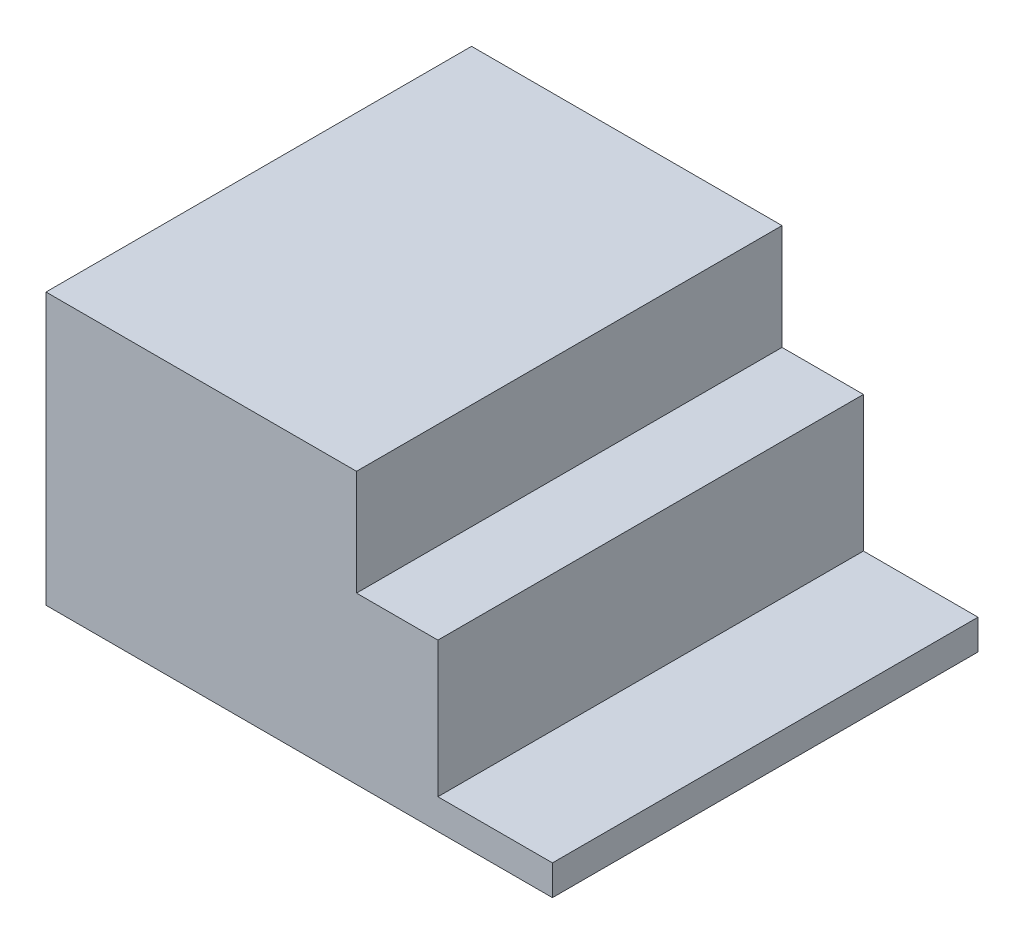
ISO-10303-21;
HEADER;
FILE_DESCRIPTION(('STEP AP214'),'2;1');
FILE_NAME('part.step','',(''),(''),'','','');
FILE_SCHEMA(('AUTOMOTIVE_DESIGN { 1 0 10303 214 1 1 1 1 }'));
ENDSEC;
DATA;
#1=APPLICATION_CONTEXT('core data for automotive mechanical design processes');
#2=APPLICATION_PROTOCOL_DEFINITION('international standard','automotive_design',2000,#1);
#3=PRODUCT_CONTEXT('',#1,'mechanical');
#4=PRODUCT('Part','Part','',(#3));
#5=PRODUCT_RELATED_PRODUCT_CATEGORY('part','',(#4));
#6=PRODUCT_DEFINITION_FORMATION('','',#4);
#7=PRODUCT_DEFINITION_CONTEXT('part definition',#1,'design');
#8=PRODUCT_DEFINITION('design','',#6,#7);
#9=PRODUCT_DEFINITION_SHAPE('','',#8);
#10=(LENGTH_UNIT() NAMED_UNIT(*) SI_UNIT(.MILLI.,.METRE.));
#11=(NAMED_UNIT(*) PLANE_ANGLE_UNIT() SI_UNIT($,.RADIAN.));
#12=(NAMED_UNIT(*) SI_UNIT($,.STERADIAN.) SOLID_ANGLE_UNIT());
#13=UNCERTAINTY_MEASURE_WITH_UNIT(LENGTH_MEASURE(1.E-05),#10,'distance_accuracy_value','');
#14=(GEOMETRIC_REPRESENTATION_CONTEXT(3) GLOBAL_UNCERTAINTY_ASSIGNED_CONTEXT((#13)) GLOBAL_UNIT_ASSIGNED_CONTEXT((#10,
#11,#12)) REPRESENTATION_CONTEXT('',''));
#15=CARTESIAN_POINT('',(0.,0.,0.));
#16=DIRECTION('',(0.,0.,1.));
#17=DIRECTION('',(1.,0.,0.));
#18=AXIS2_PLACEMENT_3D('',#15,#16,#17);
#19=CARTESIAN_POINT('',(125.,90.,70.5825680881899));
#20=DIRECTION('',(0.,0.,1.));
#21=DIRECTION('',(1.,0.,0.));
#22=AXIS2_PLACEMENT_3D('',#19,#20,#21);
#23=PLANE('',#22);
#24=DIRECTION('',(0.,-1.,0.));
#25=VECTOR('',#24,1.);
#26=CARTESIAN_POINT('',(125.,90.,70.5825680881899));
#27=LINE('',#26,#25);
#28=CARTESIAN_POINT('',(125.,10.,70.5825680881899));
#29=VERTEX_POINT('',#28);
#30=CARTESIAN_POINT('',(125.,0.,70.5825680881899));
#31=VERTEX_POINT('',#30);
#32=EDGE_CURVE('E11',#29,#31,#27,.T.);
#33=ORIENTED_EDGE('',*,*,#32,.F.);
#34=DIRECTION('',(-1.,0.,0.));
#35=VECTOR('',#34,1.);
#36=CARTESIAN_POINT('',(0.,9.99999999999998,70.5825680881899));
#37=LINE('',#36,#35);
#38=CARTESIAN_POINT('',(87.,9.99999999999999,70.5825680881899));
#39=VERTEX_POINT('',#38);
#40=EDGE_CURVE('E135',#29,#39,#37,.T.);
#41=ORIENTED_EDGE('',*,*,#40,.T.);
#42=DIRECTION('',(0.,1.,0.));
#43=VECTOR('',#42,1.);
#44=CARTESIAN_POINT('',(87.,0.,70.5825680881899));
#45=LINE('',#44,#43);
#46=CARTESIAN_POINT('',(87.,55.,70.5825680881899));
#47=VERTEX_POINT('',#46);
#48=EDGE_CURVE('E137',#39,#47,#45,.T.);
#49=ORIENTED_EDGE('',*,*,#48,.T.);
#50=DIRECTION('',(-1.,0.,0.));
#51=VECTOR('',#50,1.);
#52=CARTESIAN_POINT('',(0.,55.,70.5825680881899));
#53=LINE('',#52,#51);
#54=CARTESIAN_POINT('',(60.,55.,70.5825680881899));
#55=VERTEX_POINT('',#54);
#56=EDGE_CURVE('E140',#47,#55,#53,.T.);
#57=ORIENTED_EDGE('',*,*,#56,.T.);
#58=DIRECTION('',(0.,1.,0.));
#59=VECTOR('',#58,1.);
#60=CARTESIAN_POINT('',(60.,0.,70.5825680881899));
#61=LINE('',#60,#59);
#62=CARTESIAN_POINT('',(60.,90.,70.5825680881899));
#63=VERTEX_POINT('',#62);
#64=EDGE_CURVE('E143',#55,#63,#61,.T.);
#65=ORIENTED_EDGE('',*,*,#64,.T.);
#66=DIRECTION('',(-1.,0.,0.));
#67=VECTOR('',#66,1.);
#68=CARTESIAN_POINT('',(125.,90.,70.5825680881899));
#69=LINE('',#68,#67);
#70=CARTESIAN_POINT('',(-43.,90.,70.5825680881899));
#71=VERTEX_POINT('',#70);
#72=EDGE_CURVE('E96',#63,#71,#69,.T.);
#73=ORIENTED_EDGE('',*,*,#72,.T.);
#74=DIRECTION('',(0.,-1.,0.));
#75=VECTOR('',#74,1.);
#76=CARTESIAN_POINT('',(-43.,90.,70.5825680881899));
#77=LINE('',#76,#75);
#78=CARTESIAN_POINT('',(-43.,0.,70.5825680881899));
#79=VERTEX_POINT('',#78);
#80=EDGE_CURVE('E37',#71,#79,#77,.T.);
#81=ORIENTED_EDGE('',*,*,#80,.T.);
#82=DIRECTION('',(-1.,0.,0.));
#83=VECTOR('',#82,1.);
#84=CARTESIAN_POINT('',(125.,0.,70.5825680881899));
#85=LINE('',#84,#83);
#86=EDGE_CURVE('E93',#31,#79,#85,.T.);
#87=ORIENTED_EDGE('',*,*,#86,.F.);
#88=EDGE_LOOP('',(#33,#41,#49,#57,#65,#73,#81,#87));
#89=FACE_BOUND('',#88,.T.);
#90=ADVANCED_FACE('F34',(#89),#23,.T.);
#91=CARTESIAN_POINT('',(125.,90.,70.5825680881899));
#92=DIRECTION('',(-1.,0.,0.));
#93=DIRECTION('',(0.,0.,1.));
#94=AXIS2_PLACEMENT_3D('',#91,#92,#93);
#95=PLANE('',#94);
#96=DIRECTION('',(0.,0.,1.));
#97=VECTOR('',#96,1.);
#98=CARTESIAN_POINT('',(125.,10.,-70.58256808819));
#99=LINE('',#98,#97);
#100=CARTESIAN_POINT('',(125.,10.,-70.58256808819));
#101=VERTEX_POINT('',#100);
#102=EDGE_CURVE('E85',#101,#29,#99,.T.);
#103=ORIENTED_EDGE('',*,*,#102,.T.);
#104=ORIENTED_EDGE('',*,*,#32,.T.);
#105=DIRECTION('',(0.,0.,-1.));
#106=VECTOR('',#105,1.);
#107=CARTESIAN_POINT('',(125.,0.,70.5825680881899));
#108=LINE('',#107,#106);
#109=CARTESIAN_POINT('',(125.,0.,-70.58256808819));
#110=VERTEX_POINT('',#109);
#111=EDGE_CURVE('E81',#31,#110,#108,.T.);
#112=ORIENTED_EDGE('',*,*,#111,.T.);
#113=DIRECTION('',(0.,-1.,0.));
#114=VECTOR('',#113,1.);
#115=CARTESIAN_POINT('',(125.,90.,-70.58256808819));
#116=LINE('',#115,#114);
#117=EDGE_CURVE('E42',#101,#110,#116,.T.);
#118=ORIENTED_EDGE('',*,*,#117,.F.);
#119=EDGE_LOOP('',(#103,#104,#112,#118));
#120=FACE_BOUND('',#119,.T.);
#121=ADVANCED_FACE('F79',(#120),#95,.F.);
#122=CARTESIAN_POINT('',(125.,90.,-70.58256808819));
#123=DIRECTION('',(0.,0.,1.));
#124=DIRECTION('',(1.,0.,0.));
#125=AXIS2_PLACEMENT_3D('',#122,#123,#124);
#126=PLANE('',#125);
#127=DIRECTION('',(-1.,0.,0.));
#128=VECTOR('',#127,1.);
#129=CARTESIAN_POINT('',(0.,9.99999999999998,-70.58256808819));
#130=LINE('',#129,#128);
#131=CARTESIAN_POINT('',(87.,9.99999999999999,-70.58256808819));
#132=VERTEX_POINT('',#131);
#133=EDGE_CURVE('E118',#101,#132,#130,.T.);
#134=ORIENTED_EDGE('',*,*,#133,.F.);
#135=ORIENTED_EDGE('',*,*,#117,.T.);
#136=DIRECTION('',(-1.,0.,0.));
#137=VECTOR('',#136,1.);
#138=CARTESIAN_POINT('',(125.,0.,-70.58256808819));
#139=LINE('',#138,#137);
#140=CARTESIAN_POINT('',(-43.,0.,-70.58256808819));
#141=VERTEX_POINT('',#140);
#142=EDGE_CURVE('E95',#110,#141,#139,.T.);
#143=ORIENTED_EDGE('',*,*,#142,.T.);
#144=DIRECTION('',(0.,-1.,0.));
#145=VECTOR('',#144,1.);
#146=CARTESIAN_POINT('',(-43.,90.,-70.58256808819));
#147=LINE('',#146,#145);
#148=CARTESIAN_POINT('',(-43.,90.,-70.58256808819));
#149=VERTEX_POINT('',#148);
#150=EDGE_CURVE('E109',#149,#141,#147,.T.);
#151=ORIENTED_EDGE('',*,*,#150,.F.);
#152=DIRECTION('',(-1.,0.,0.));
#153=VECTOR('',#152,1.);
#154=CARTESIAN_POINT('',(125.,90.,-70.58256808819));
#155=LINE('',#154,#153);
#156=CARTESIAN_POINT('',(60.,90.,-70.58256808819));
#157=VERTEX_POINT('',#156);
#158=EDGE_CURVE('E58',#157,#149,#155,.T.);
#159=ORIENTED_EDGE('',*,*,#158,.F.);
#160=DIRECTION('',(0.,1.,0.));
#161=VECTOR('',#160,1.);
#162=CARTESIAN_POINT('',(60.,0.,-70.58256808819));
#163=LINE('',#162,#161);
#164=CARTESIAN_POINT('',(60.,55.,-70.58256808819));
#165=VERTEX_POINT('',#164);
#166=EDGE_CURVE('E50',#165,#157,#163,.T.);
#167=ORIENTED_EDGE('',*,*,#166,.F.);
#168=DIRECTION('',(-1.,0.,0.));
#169=VECTOR('',#168,1.);
#170=CARTESIAN_POINT('',(0.,55.,-70.58256808819));
#171=LINE('',#170,#169);
#172=CARTESIAN_POINT('',(87.,55.,-70.58256808819));
#173=VERTEX_POINT('',#172);
#174=EDGE_CURVE('E131',#173,#165,#171,.T.);
#175=ORIENTED_EDGE('',*,*,#174,.F.);
#176=DIRECTION('',(0.,1.,0.));
#177=VECTOR('',#176,1.);
#178=CARTESIAN_POINT('',(87.,0.,-70.58256808819));
#179=LINE('',#178,#177);
#180=EDGE_CURVE('E128',#132,#173,#179,.T.);
#181=ORIENTED_EDGE('',*,*,#180,.F.);
#182=EDGE_LOOP('',(#134,#135,#143,#151,#159,#167,#175,#181));
#183=FACE_BOUND('',#182,.T.);
#184=ADVANCED_FACE('F154',(#183),#126,.F.);
#185=CARTESIAN_POINT('',(0.,90.,0.));
#186=DIRECTION('',(0.,-1.,0.));
#187=DIRECTION('',(0.,0.,-1.));
#188=AXIS2_PLACEMENT_3D('',#185,#186,#187);
#189=PLANE('',#188);
#190=DIRECTION('',(0.,0.,1.));
#191=VECTOR('',#190,1.);
#192=CARTESIAN_POINT('',(60.,90.,-70.58256808819));
#193=LINE('',#192,#191);
#194=EDGE_CURVE('E115',#157,#63,#193,.T.);
#195=ORIENTED_EDGE('',*,*,#194,.F.);
#196=ORIENTED_EDGE('',*,*,#158,.T.);
#197=DIRECTION('',(0.,0.,-1.));
#198=VECTOR('',#197,1.);
#199=CARTESIAN_POINT('',(-43.,90.,70.5825680881899));
#200=LINE('',#199,#198);
#201=EDGE_CURVE('E112',#71,#149,#200,.T.);
#202=ORIENTED_EDGE('',*,*,#201,.F.);
#203=ORIENTED_EDGE('',*,*,#72,.F.);
#204=EDGE_LOOP('',(#195,#196,#202,#203));
#205=FACE_BOUND('',#204,.T.);
#206=ADVANCED_FACE('F151',(#205),#189,.F.);
#207=CARTESIAN_POINT('',(-43.,90.,70.5825680881899));
#208=DIRECTION('',(-1.,0.,0.));
#209=DIRECTION('',(0.,0.,1.));
#210=AXIS2_PLACEMENT_3D('',#207,#208,#209);
#211=PLANE('',#210);
#212=DIRECTION('',(0.,0.,-1.));
#213=VECTOR('',#212,1.);
#214=CARTESIAN_POINT('',(-43.,0.,70.5825680881899));
#215=LINE('',#214,#213);
#216=EDGE_CURVE('E100',#79,#141,#215,.T.);
#217=ORIENTED_EDGE('',*,*,#216,.F.);
#218=ORIENTED_EDGE('',*,*,#80,.F.);
#219=ORIENTED_EDGE('',*,*,#201,.T.);
#220=ORIENTED_EDGE('',*,*,#150,.T.);
#221=EDGE_LOOP('',(#217,#218,#219,#220));
#222=FACE_BOUND('',#221,.T.);
#223=ADVANCED_FACE('F157',(#222),#211,.T.);
#224=CARTESIAN_POINT('',(0.,0.,0.));
#225=DIRECTION('',(0.,-1.,0.));
#226=DIRECTION('',(0.,0.,-1.));
#227=AXIS2_PLACEMENT_3D('',#224,#225,#226);
#228=PLANE('',#227);
#229=ORIENTED_EDGE('',*,*,#86,.T.);
#230=ORIENTED_EDGE('',*,*,#216,.T.);
#231=ORIENTED_EDGE('',*,*,#142,.F.);
#232=ORIENTED_EDGE('',*,*,#111,.F.);
#233=EDGE_LOOP('',(#229,#230,#231,#232));
#234=FACE_BOUND('',#233,.T.);
#235=ADVANCED_FACE('F91',(#234),#228,.T.);
#236=CARTESIAN_POINT('',(0.,9.99999999999998,-70.58256808819));
#237=DIRECTION('',(0.,1.,0.));
#238=DIRECTION('',(-1.,0.,0.));
#239=AXIS2_PLACEMENT_3D('',#236,#237,#238);
#240=PLANE('',#239);
#241=ORIENTED_EDGE('',*,*,#102,.F.);
#242=ORIENTED_EDGE('',*,*,#133,.T.);
#243=DIRECTION('',(0.,0.,1.));
#244=VECTOR('',#243,1.);
#245=CARTESIAN_POINT('',(87.,9.99999999999999,-70.58256808819));
#246=LINE('',#245,#244);
#247=EDGE_CURVE('E103',#132,#39,#246,.T.);
#248=ORIENTED_EDGE('',*,*,#247,.T.);
#249=ORIENTED_EDGE('',*,*,#40,.F.);
#250=EDGE_LOOP('',(#241,#242,#248,#249));
#251=FACE_BOUND('',#250,.T.);
#252=ADVANCED_FACE('F162',(#251),#240,.T.);
#253=CARTESIAN_POINT('',(87.,0.,-70.58256808819));
#254=DIRECTION('',(1.,0.,0.));
#255=DIRECTION('',(0.,0.,-1.));
#256=AXIS2_PLACEMENT_3D('',#253,#254,#255);
#257=PLANE('',#256);
#258=ORIENTED_EDGE('',*,*,#247,.F.);
#259=ORIENTED_EDGE('',*,*,#180,.T.);
#260=DIRECTION('',(0.,0.,1.));
#261=VECTOR('',#260,1.);
#262=CARTESIAN_POINT('',(87.,55.,-70.58256808819));
#263=LINE('',#262,#261);
#264=EDGE_CURVE('E121',#173,#47,#263,.T.);
#265=ORIENTED_EDGE('',*,*,#264,.T.);
#266=ORIENTED_EDGE('',*,*,#48,.F.);
#267=EDGE_LOOP('',(#258,#259,#265,#266));
#268=FACE_BOUND('',#267,.T.);
#269=ADVANCED_FACE('F183',(#268),#257,.T.);
#270=CARTESIAN_POINT('',(0.,55.,-70.58256808819));
#271=DIRECTION('',(0.,1.,0.));
#272=DIRECTION('',(0.,0.,1.));
#273=AXIS2_PLACEMENT_3D('',#270,#271,#272);
#274=PLANE('',#273);
#275=ORIENTED_EDGE('',*,*,#264,.F.);
#276=ORIENTED_EDGE('',*,*,#174,.T.);
#277=DIRECTION('',(0.,0.,1.));
#278=VECTOR('',#277,1.);
#279=CARTESIAN_POINT('',(60.,55.,-70.58256808819));
#280=LINE('',#279,#278);
#281=EDGE_CURVE('E117',#165,#55,#280,.T.);
#282=ORIENTED_EDGE('',*,*,#281,.T.);
#283=ORIENTED_EDGE('',*,*,#56,.F.);
#284=EDGE_LOOP('',(#275,#276,#282,#283));
#285=FACE_BOUND('',#284,.T.);
#286=ADVANCED_FACE('F180',(#285),#274,.T.);
#287=CARTESIAN_POINT('',(60.,0.,-70.58256808819));
#288=DIRECTION('',(1.,0.,0.));
#289=DIRECTION('',(0.,0.,-1.));
#290=AXIS2_PLACEMENT_3D('',#287,#288,#289);
#291=PLANE('',#290);
#292=ORIENTED_EDGE('',*,*,#281,.F.);
#293=ORIENTED_EDGE('',*,*,#166,.T.);
#294=ORIENTED_EDGE('',*,*,#194,.T.);
#295=ORIENTED_EDGE('',*,*,#64,.F.);
#296=EDGE_LOOP('',(#292,#293,#294,#295));
#297=FACE_BOUND('',#296,.T.);
#298=ADVANCED_FACE('F177',(#297),#291,.T.);
#299=CLOSED_SHELL('',(#90,#121,#184,#206,#223,#235,#252,#269,#286,#298));
#300=MANIFOLD_SOLID_BREP('B2',#299);
#301=ADVANCED_BREP_SHAPE_REPRESENTATION('',(#18,#300),#14);
#302=SHAPE_DEFINITION_REPRESENTATION(#9,#301);
ENDSEC;
END-ISO-10303-21;
